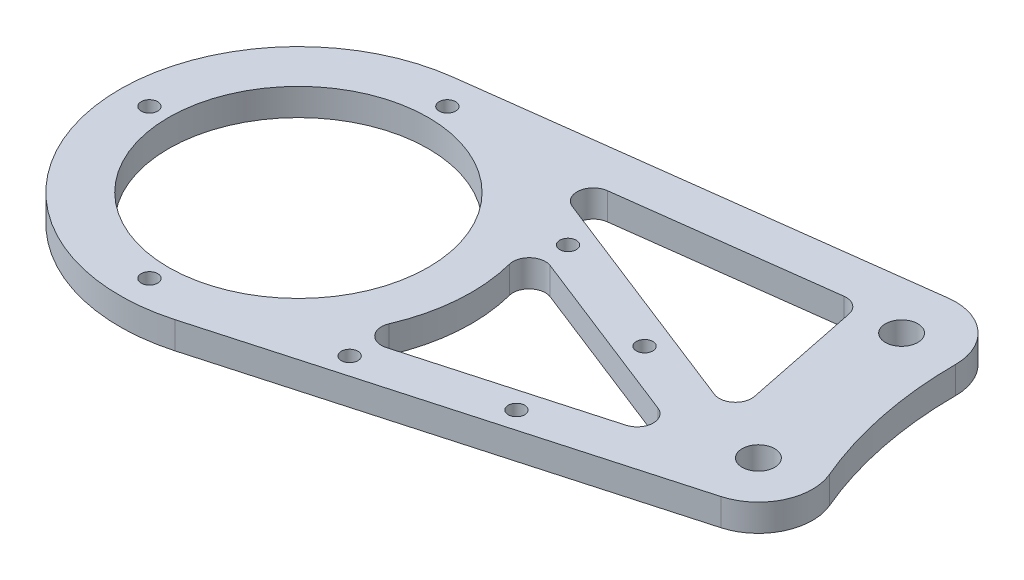
ISO-10303-21;
HEADER;
FILE_DESCRIPTION(('STEP AP214'),'2;1');
FILE_NAME('part.step','',(''),(''),'','','');
FILE_SCHEMA(('AUTOMOTIVE_DESIGN { 1 0 10303 214 1 1 1 1 }'));
ENDSEC;
DATA;
#1=APPLICATION_CONTEXT('core data for automotive mechanical design processes');
#2=APPLICATION_PROTOCOL_DEFINITION('international standard','automotive_design',2000,#1);
#3=PRODUCT_CONTEXT('',#1,'mechanical');
#4=PRODUCT('Part','Part','',(#3));
#5=PRODUCT_RELATED_PRODUCT_CATEGORY('part','',(#4));
#6=PRODUCT_DEFINITION_FORMATION('','',#4);
#7=PRODUCT_DEFINITION_CONTEXT('part definition',#1,'design');
#8=PRODUCT_DEFINITION('design','',#6,#7);
#9=PRODUCT_DEFINITION_SHAPE('','',#8);
#10=(LENGTH_UNIT() NAMED_UNIT(*) SI_UNIT(.MILLI.,.METRE.));
#11=(NAMED_UNIT(*) PLANE_ANGLE_UNIT() SI_UNIT($,.RADIAN.));
#12=(NAMED_UNIT(*) SI_UNIT($,.STERADIAN.) SOLID_ANGLE_UNIT());
#13=UNCERTAINTY_MEASURE_WITH_UNIT(LENGTH_MEASURE(1.E-05),#10,'distance_accuracy_value','');
#14=(GEOMETRIC_REPRESENTATION_CONTEXT(3) GLOBAL_UNCERTAINTY_ASSIGNED_CONTEXT((#13)) GLOBAL_UNIT_ASSIGNED_CONTEXT((#10,
#11,#12)) REPRESENTATION_CONTEXT('',''));
#15=CARTESIAN_POINT('',(0.,0.,0.));
#16=DIRECTION('',(0.,0.,1.));
#17=DIRECTION('',(1.,0.,0.));
#18=AXIS2_PLACEMENT_3D('',#15,#16,#17);
#19=CARTESIAN_POINT('',(0.,5.,0.));
#20=DIRECTION('',(0.,1.,0.));
#21=DIRECTION('',(0.,0.,1.));
#22=AXIS2_PLACEMENT_3D('',#19,#20,#21);
#23=PLANE('',#22);
#24=CARTESIAN_POINT('',(0.,5.,-27.5221634078138));
#25=DIRECTION('',(0.,1.,0.));
#26=DIRECTION('',(0.,0.,1.));
#27=AXIS2_PLACEMENT_3D('',#24,#25,#26);
#28=CIRCLE('',#27,1.525);
#29=CARTESIAN_POINT('',(0.,5.,-25.9971634078138));
#30=VERTEX_POINT('',#29);
#31=EDGE_CURVE('E362',#30,#30,#28,.T.);
#32=ORIENTED_EDGE('',*,*,#31,.F.);
#33=EDGE_LOOP('',(#32));
#34=FACE_BOUND('',#33,.T.);
#35=CARTESIAN_POINT('',(33.3215348622938,5.,-16.496811603075));
#36=DIRECTION('',(0.,1.,0.));
#37=DIRECTION('',(0.,0.,1.));
#38=AXIS2_PLACEMENT_3D('',#35,#36,#37);
#39=CIRCLE('',#38,1.525);
#40=CARTESIAN_POINT('',(33.3215348622938,5.,-14.971811603075));
#41=VERTEX_POINT('',#40);
#42=EDGE_CURVE('E365',#41,#41,#39,.T.);
#43=ORIENTED_EDGE('',*,*,#42,.F.);
#44=EDGE_LOOP('',(#43));
#45=FACE_BOUND('',#44,.T.);
#46=CARTESIAN_POINT('',(-27.5221634078138,5.,0.));
#47=DIRECTION('',(0.,1.,0.));
#48=DIRECTION('',(0.,0.,1.));
#49=AXIS2_PLACEMENT_3D('',#46,#47,#48);
#50=CIRCLE('',#49,1.525);
#51=CARTESIAN_POINT('',(-27.5221634078138,5.,1.525));
#52=VERTEX_POINT('',#51);
#53=EDGE_CURVE('E368',#52,#52,#50,.T.);
#54=ORIENTED_EDGE('',*,*,#53,.F.);
#55=EDGE_LOOP('',(#54));
#56=FACE_BOUND('',#55,.T.);
#57=CARTESIAN_POINT('',(0.,5.,27.5221634078138));
#58=DIRECTION('',(0.,1.,0.));
#59=DIRECTION('',(0.,0.,1.));
#60=AXIS2_PLACEMENT_3D('',#57,#58,#59);
#61=CIRCLE('',#60,1.525);
#62=CARTESIAN_POINT('',(0.,5.,29.0471634078138));
#63=VERTEX_POINT('',#62);
#64=EDGE_CURVE('E371',#63,#63,#61,.T.);
#65=ORIENTED_EDGE('',*,*,#64,.F.);
#66=EDGE_LOOP('',(#65));
#67=FACE_BOUND('',#66,.T.);
#68=CARTESIAN_POINT('',(30.9017025254333,5.,21.4381076218142));
#69=DIRECTION('',(0.,1.,0.));
#70=DIRECTION('',(0.,0.,1.));
#71=AXIS2_PLACEMENT_3D('',#68,#69,#70);
#72=CIRCLE('',#71,1.52499999999999);
#73=CARTESIAN_POINT('',(30.9017025254333,5.,22.9631076218142));
#74=VERTEX_POINT('',#73);
#75=EDGE_CURVE('E374',#74,#74,#72,.T.);
#76=ORIENTED_EDGE('',*,*,#75,.F.);
#77=EDGE_LOOP('',(#76));
#78=FACE_BOUND('',#77,.T.);
#79=CARTESIAN_POINT('',(56.596303963621,5.,-7.3707432667154));
#80=DIRECTION('',(0.,1.,0.));
#81=DIRECTION('',(0.,0.,1.));
#82=AXIS2_PLACEMENT_3D('',#79,#80,#81);
#83=CIRCLE('',#82,1.525);
#84=CARTESIAN_POINT('',(56.596303963621,5.,-5.84574326671541));
#85=VERTEX_POINT('',#84);
#86=EDGE_CURVE('E377',#85,#85,#83,.T.);
#87=ORIENTED_EDGE('',*,*,#86,.F.);
#88=EDGE_LOOP('',(#87));
#89=FACE_BOUND('',#88,.T.);
#90=CARTESIAN_POINT('',(54.9690819907024,5.,14.6734017394612));
#91=DIRECTION('',(0.,1.,0.));
#92=DIRECTION('',(0.,0.,1.));
#93=AXIS2_PLACEMENT_3D('',#90,#91,#92);
#94=CIRCLE('',#93,1.525);
#95=CARTESIAN_POINT('',(54.9690819907024,5.,16.1984017394612));
#96=VERTEX_POINT('',#95);
#97=EDGE_CURVE('E380',#96,#96,#94,.T.);
#98=ORIENTED_EDGE('',*,*,#97,.F.);
#99=EDGE_LOOP('',(#98));
#100=FACE_BOUND('',#99,.T.);
#101=CARTESIAN_POINT('',(0.,5.,0.));
#102=DIRECTION('',(0.,1.,0.));
#103=DIRECTION('',(0.,0.,1.));
#104=AXIS2_PLACEMENT_3D('',#101,#102,#103);
#105=CIRCLE('',#104,24.);
#106=CARTESIAN_POINT('',(0.,5.,24.));
#107=VERTEX_POINT('',#106);
#108=EDGE_CURVE('E212',#107,#107,#105,.T.);
#109=ORIENTED_EDGE('',*,*,#108,.F.);
#110=EDGE_LOOP('',(#109));
#111=FACE_BOUND('',#110,.T.);
#112=CARTESIAN_POINT('',(163.242912543457,5.,-33.2121459215883));
#113=DIRECTION('',(0.,1.,0.));
#114=DIRECTION('',(0.,0.,1.));
#115=AXIS2_PLACEMENT_3D('',#112,#113,#114);
#116=CIRCLE('',#115,75.);
#117=CARTESIAN_POINT('',(88.2429125434574,5.,-33.2121459215884));
#118=VERTEX_POINT('',#117);
#119=CARTESIAN_POINT('',(94.2050485345244,5.,-3.90731128489274));
#120=VERTEX_POINT('',#119);
#121=EDGE_CURVE('E185',#118,#120,#116,.T.);
#122=ORIENTED_EDGE('',*,*,#121,.F.);
#123=CARTESIAN_POINT('',(78.2429125434574,5.,-33.2121459215884));
#124=DIRECTION('',(0.,1.,0.));
#125=DIRECTION('',(0.,0.,1.));
#126=AXIS2_PLACEMENT_3D('',#123,#124,#125);
#127=CIRCLE('',#126,9.99999999999999);
#128=CARTESIAN_POINT('',(76.9721406469134,5.,-43.131074229977));
#129=VERTEX_POINT('',#128);
#130=EDGE_CURVE('E195',#118,#129,#127,.T.);
#131=ORIENTED_EDGE('',*,*,#130,.T.);
#132=DIRECTION('',(0.991892830838866,0.,-0.127077189654403));
#133=VECTOR('',#132,1.);
#134=CARTESIAN_POINT('',(-4.19354725859528,5.,-32.7324634176826));
#135=LINE('',#134,#133);
#136=CARTESIAN_POINT('',(-4.19354725859528,5.,-32.7324634176826));
#137=VERTEX_POINT('',#136);
#138=EDGE_CURVE('E200',#137,#129,#135,.T.);
#139=ORIENTED_EDGE('',*,*,#138,.F.);
#140=CARTESIAN_POINT('',(0.,5.,0.));
#141=DIRECTION('',(0.,1.,0.));
#142=DIRECTION('',(0.,0.,1.));
#143=AXIS2_PLACEMENT_3D('',#140,#141,#142);
#144=CIRCLE('',#143,33.);
#145=CARTESIAN_POINT('',(8.92941176470588,5.,31.7689408941553));
#146=VERTEX_POINT('',#145);
#147=EDGE_CURVE('E216',#137,#146,#144,.T.);
#148=ORIENTED_EDGE('',*,*,#147,.T.);
#149=DIRECTION('',(0.962695178610766,0.,-0.270588235294118));
#150=VECTOR('',#149,1.);
#151=CARTESIAN_POINT('',(8.92941176470588,5.,31.7689408941553));
#152=LINE('',#151,#150);
#153=CARTESIAN_POINT('',(87.7058823529412,5.,9.62695178610766));
#154=VERTEX_POINT('',#153);
#155=EDGE_CURVE('E218',#146,#154,#152,.T.);
#156=ORIENTED_EDGE('',*,*,#155,.T.);
#157=CARTESIAN_POINT('',(85.,5.,0.));
#158=DIRECTION('',(0.,1.,0.));
#159=DIRECTION('',(0.,0.,1.));
#160=AXIS2_PLACEMENT_3D('',#157,#158,#159);
#161=CIRCLE('',#160,9.99999999999999);
#162=EDGE_CURVE('E204',#154,#120,#161,.T.);
#163=ORIENTED_EDGE('',*,*,#162,.T.);
#164=EDGE_LOOP('',(#122,#131,#139,#148,#156,#163));
#165=FACE_BOUND('',#164,.T.);
#166=CARTESIAN_POINT('',(85.,5.,0.));
#167=DIRECTION('',(0.,1.,0.));
#168=DIRECTION('',(0.,0.,1.));
#169=AXIS2_PLACEMENT_3D('',#166,#167,#168);
#170=CIRCLE('',#169,3.00000000000001);
#171=CARTESIAN_POINT('',(85.,5.,3.00000000000001));
#172=VERTEX_POINT('',#171);
#173=EDGE_CURVE('E221',#172,#172,#170,.T.);
#174=ORIENTED_EDGE('',*,*,#173,.F.);
#175=EDGE_LOOP('',(#174));
#176=FACE_BOUND('',#175,.T.);
#177=CARTESIAN_POINT('',(78.2429125434574,5.,-33.2121459215884));
#178=DIRECTION('',(0.,1.,0.));
#179=DIRECTION('',(0.,0.,1.));
#180=AXIS2_PLACEMENT_3D('',#177,#178,#179);
#181=CIRCLE('',#180,3.00000000000002);
#182=CARTESIAN_POINT('',(78.2429125434574,5.,-30.2121459215883));
#183=VERTEX_POINT('',#182);
#184=EDGE_CURVE('E224',#183,#183,#181,.T.);
#185=ORIENTED_EDGE('',*,*,#184,.F.);
#186=EDGE_LOOP('',(#185));
#187=FACE_BOUND('',#186,.T.);
#188=DIRECTION('',(-0.930990764053088,0.,-0.365042733454383));
#189=VECTOR('',#188,1.);
#190=CARTESIAN_POINT('',(11.5069366947841,5.,-29.3468429956469));
#191=LINE('',#190,#189);
#192=CARTESIAN_POINT('',(70.7471802784156,5.,-6.11866363742589));
#193=VERTEX_POINT('',#192);
#194=CARTESIAN_POINT('',(27.5492275878876,5.,-23.056639113286));
#195=VERTEX_POINT('',#194);
#196=EDGE_CURVE('E323',#193,#195,#191,.T.);
#197=ORIENTED_EDGE('',*,*,#196,.T.);
#198=CARTESIAN_POINT('',(28.6443557882508,5.,-25.8496114054452));
#199=DIRECTION('',(0.,1.,0.));
#200=DIRECTION('',(0.,0.,1.));
#201=AXIS2_PLACEMENT_3D('',#198,#199,#200);
#202=CIRCLE('',#201,3.);
#203=CARTESIAN_POINT('',(28.2631242192876,5.,-28.8252898979618));
#204=VERTEX_POINT('',#203);
#205=EDGE_CURVE('E314',#195,#204,#202,.F.);
#206=ORIENTED_EDGE('',*,*,#205,.T.);
#207=DIRECTION('',(0.991892830838866,0.,-0.127077189654402));
#208=VECTOR('',#207,1.);
#209=CARTESIAN_POINT('',(-3.17692974136006,5.,-24.7973207709716));
#210=LINE('',#209,#208);
#211=CARTESIAN_POINT('',(67.0051772793221,5.,-33.7887608206695));
#212=VERTEX_POINT('',#211);
#213=EDGE_CURVE('E329',#204,#212,#210,.T.);
#214=ORIENTED_EDGE('',*,*,#213,.T.);
#215=CARTESIAN_POINT('',(67.3864088482853,5.,-30.8130823281529));
#216=DIRECTION('',(0.,1.,0.));
#217=DIRECTION('',(0.,0.,1.));
#218=AXIS2_PLACEMENT_3D('',#215,#216,#217);
#219=CIRCLE('',#218,3.);
#220=CARTESIAN_POINT('',(70.3261829621477,5.,-31.4111861314045));
#221=VERTEX_POINT('',#220);
#222=EDGE_CURVE('E78',#212,#221,#219,.F.);
#223=ORIENTED_EDGE('',*,*,#222,.T.);
#224=DIRECTION('',(0.199367934417198,0.,0.979924704620829));
#225=VECTOR('',#224,1.);
#226=CARTESIAN_POINT('',(73.6675519539497,5.,-14.9878328379459));
#227=LINE('',#226,#225);
#228=CARTESIAN_POINT('',(74.7820825926413,5.,-9.50973973283677));
#229=VERTEX_POINT('',#228);
#230=EDGE_CURVE('E324',#221,#229,#227,.T.);
#231=ORIENTED_EDGE('',*,*,#230,.T.);
#232=CARTESIAN_POINT('',(71.8423084787788,5.,-8.91163592958517));
#233=DIRECTION('',(0.,1.,0.));
#234=DIRECTION('',(0.,0.,1.));
#235=AXIS2_PLACEMENT_3D('',#232,#233,#234);
#236=CIRCLE('',#235,3.);
#237=EDGE_CURVE('E64',#229,#193,#236,.F.);
#238=ORIENTED_EDGE('',*,*,#237,.T.);
#239=EDGE_LOOP('',(#197,#206,#214,#223,#231,#238));
#240=FACE_BOUND('',#239,.T.);
#241=DIRECTION('',(0.962695178610766,0.,-0.270588235294118));
#242=VECTOR('',#241,1.);
#243=CARTESIAN_POINT('',(6.76470588235294,5.,24.0673794652692));
#244=LINE('',#243,#242);
#245=CARTESIAN_POINT('',(32.9705347593037,5.,16.7016118289686));
#246=VERTEX_POINT('',#245);
#247=CARTESIAN_POINT('',(67.5044798398151,5.,6.99503028093982));
#248=VERTEX_POINT('',#247);
#249=EDGE_CURVE('E356',#246,#248,#244,.T.);
#250=ORIENTED_EDGE('',*,*,#249,.F.);
#251=CARTESIAN_POINT('',(32.1587700534214,5.,13.8135262931363));
#252=DIRECTION('',(0.,1.,0.));
#253=DIRECTION('',(0.,0.,1.));
#254=AXIS2_PLACEMENT_3D('',#251,#252,#253);
#255=CIRCLE('',#254,3.);
#256=CARTESIAN_POINT('',(29.4023040488424,5.,12.6295097537246));
#257=VERTEX_POINT('',#256);
#258=EDGE_CURVE('E310',#246,#257,#255,.F.);
#259=ORIENTED_EDGE('',*,*,#258,.T.);
#260=CARTESIAN_POINT('',(0.,5.,0.));
#261=DIRECTION('',(0.,1.,0.));
#262=DIRECTION('',(0.,0.,1.));
#263=AXIS2_PLACEMENT_3D('',#260,#261,#262);
#264=CIRCLE('',#263,32.);
#265=CARTESIAN_POINT('',(30.9823975337499,5.,-8.0056881690889));
#266=VERTEX_POINT('',#265);
#267=EDGE_CURVE('E359',#257,#266,#264,.T.);
#268=ORIENTED_EDGE('',*,*,#267,.T.);
#269=CARTESIAN_POINT('',(33.8869973025389,5.,-8.75622143494099));
#270=DIRECTION('',(0.,1.,0.));
#271=DIRECTION('',(0.,0.,1.));
#272=AXIS2_PLACEMENT_3D('',#269,#270,#271);
#273=CIRCLE('',#272,3.);
#274=CARTESIAN_POINT('',(34.9821255029021,5.,-11.5491937271002));
#275=VERTEX_POINT('',#274);
#276=EDGE_CURVE('E302',#266,#275,#273,.F.);
#277=ORIENTED_EDGE('',*,*,#276,.T.);
#278=DIRECTION('',(0.930990764053088,0.,0.365042733454383));
#279=VECTOR('',#278,1.);
#280=CARTESIAN_POINT('',(8.58659482714902,5.,-21.8989168832222));
#281=LINE('',#280,#279);
#282=CARTESIAN_POINT('',(67.7878433342959,5.,1.31397245294826));
#283=VERTEX_POINT('',#282);
#284=EDGE_CURVE('E351',#275,#283,#281,.T.);
#285=ORIENTED_EDGE('',*,*,#284,.T.);
#286=CARTESIAN_POINT('',(66.6927151339328,5.,4.10694474510753));
#287=DIRECTION('',(0.,1.,0.));
#288=DIRECTION('',(0.,0.,1.));
#289=AXIS2_PLACEMENT_3D('',#286,#287,#288);
#290=CIRCLE('',#289,3.);
#291=EDGE_CURVE('E306',#283,#248,#290,.F.);
#292=ORIENTED_EDGE('',*,*,#291,.T.);
#293=EDGE_LOOP('',(#250,#259,#268,#277,#285,#292));
#294=FACE_BOUND('',#293,.T.);
#295=ADVANCED_FACE('F56',(#34,#45,#56,#67,#78,#89,#100,#111,#165,#176,#187,#240,#294),#23,.T.);
#296=CARTESIAN_POINT('',(0.,0.,0.));
#297=DIRECTION('',(0.,1.,0.));
#298=DIRECTION('',(0.,0.,1.));
#299=AXIS2_PLACEMENT_3D('',#296,#297,#298);
#300=PLANE('',#299);
#301=CARTESIAN_POINT('',(0.,0.,-27.5221634078138));
#302=DIRECTION('',(0.,-1.,0.));
#303=DIRECTION('',(0.,0.,-1.));
#304=AXIS2_PLACEMENT_3D('',#301,#302,#303);
#305=CIRCLE('',#304,1.525);
#306=CARTESIAN_POINT('',(0.,0.,-29.0471634078138));
#307=VERTEX_POINT('',#306);
#308=EDGE_CURVE('E383',#307,#307,#305,.T.);
#309=ORIENTED_EDGE('',*,*,#308,.F.);
#310=EDGE_LOOP('',(#309));
#311=FACE_BOUND('',#310,.T.);
#312=CARTESIAN_POINT('',(33.3215348622938,0.,-16.496811603075));
#313=DIRECTION('',(0.,-1.,0.));
#314=DIRECTION('',(0.,0.,-1.));
#315=AXIS2_PLACEMENT_3D('',#312,#313,#314);
#316=CIRCLE('',#315,1.525);
#317=CARTESIAN_POINT('',(33.3215348622938,0.,-18.021811603075));
#318=VERTEX_POINT('',#317);
#319=EDGE_CURVE('E399',#318,#318,#316,.T.);
#320=ORIENTED_EDGE('',*,*,#319,.F.);
#321=EDGE_LOOP('',(#320));
#322=FACE_BOUND('',#321,.T.);
#323=CARTESIAN_POINT('',(-27.5221634078138,0.,0.));
#324=DIRECTION('',(0.,-1.,0.));
#325=DIRECTION('',(0.,0.,-1.));
#326=AXIS2_PLACEMENT_3D('',#323,#324,#325);
#327=CIRCLE('',#326,1.525);
#328=CARTESIAN_POINT('',(-27.5221634078138,0.,-1.525));
#329=VERTEX_POINT('',#328);
#330=EDGE_CURVE('E396',#329,#329,#327,.T.);
#331=ORIENTED_EDGE('',*,*,#330,.F.);
#332=EDGE_LOOP('',(#331));
#333=FACE_BOUND('',#332,.T.);
#334=CARTESIAN_POINT('',(0.,0.,27.5221634078138));
#335=DIRECTION('',(0.,-1.,0.));
#336=DIRECTION('',(0.,0.,-1.));
#337=AXIS2_PLACEMENT_3D('',#334,#335,#336);
#338=CIRCLE('',#337,1.525);
#339=CARTESIAN_POINT('',(0.,0.,25.9971634078138));
#340=VERTEX_POINT('',#339);
#341=EDGE_CURVE('E393',#340,#340,#338,.T.);
#342=ORIENTED_EDGE('',*,*,#341,.F.);
#343=EDGE_LOOP('',(#342));
#344=FACE_BOUND('',#343,.T.);
#345=CARTESIAN_POINT('',(30.9017025254333,0.,21.4381076218142));
#346=DIRECTION('',(0.,-1.,0.));
#347=DIRECTION('',(0.,0.,-1.));
#348=AXIS2_PLACEMENT_3D('',#345,#346,#347);
#349=CIRCLE('',#348,1.52499999999999);
#350=CARTESIAN_POINT('',(30.9017025254333,0.,19.9131076218142));
#351=VERTEX_POINT('',#350);
#352=EDGE_CURVE('E390',#351,#351,#349,.T.);
#353=ORIENTED_EDGE('',*,*,#352,.F.);
#354=EDGE_LOOP('',(#353));
#355=FACE_BOUND('',#354,.T.);
#356=CARTESIAN_POINT('',(56.596303963621,0.,-7.3707432667154));
#357=DIRECTION('',(0.,-1.,0.));
#358=DIRECTION('',(0.,0.,-1.));
#359=AXIS2_PLACEMENT_3D('',#356,#357,#358);
#360=CIRCLE('',#359,1.525);
#361=CARTESIAN_POINT('',(56.596303963621,0.,-8.8957432667154));
#362=VERTEX_POINT('',#361);
#363=EDGE_CURVE('E387',#362,#362,#360,.T.);
#364=ORIENTED_EDGE('',*,*,#363,.F.);
#365=EDGE_LOOP('',(#364));
#366=FACE_BOUND('',#365,.T.);
#367=CARTESIAN_POINT('',(54.9690819907024,0.,14.6734017394612));
#368=DIRECTION('',(0.,-1.,0.));
#369=DIRECTION('',(0.,0.,-1.));
#370=AXIS2_PLACEMENT_3D('',#367,#368,#369);
#371=CIRCLE('',#370,1.525);
#372=CARTESIAN_POINT('',(54.9690819907024,0.,13.1484017394612));
#373=VERTEX_POINT('',#372);
#374=EDGE_CURVE('E384',#373,#373,#371,.T.);
#375=ORIENTED_EDGE('',*,*,#374,.F.);
#376=EDGE_LOOP('',(#375));
#377=FACE_BOUND('',#376,.T.);
#378=DIRECTION('',(0.199367934417198,0.,0.979924704620829));
#379=VECTOR('',#378,1.);
#380=CARTESIAN_POINT('',(73.6675519539497,0.,-14.9878328379459));
#381=LINE('',#380,#379);
#382=CARTESIAN_POINT('',(70.3261829621477,0.,-31.4111861314045));
#383=VERTEX_POINT('',#382);
#384=CARTESIAN_POINT('',(74.7820825926413,0.,-9.50973973283677));
#385=VERTEX_POINT('',#384);
#386=EDGE_CURVE('E261',#383,#385,#381,.T.);
#387=ORIENTED_EDGE('',*,*,#386,.F.);
#388=CARTESIAN_POINT('',(67.3864088482853,0.,-30.8130823281529));
#389=DIRECTION('',(0.,1.,0.));
#390=DIRECTION('',(0.,0.,1.));
#391=AXIS2_PLACEMENT_3D('',#388,#389,#390);
#392=CIRCLE('',#391,3.);
#393=CARTESIAN_POINT('',(67.0051772793221,0.,-33.7887608206695));
#394=VERTEX_POINT('',#393);
#395=EDGE_CURVE('E319',#383,#394,#392,.T.);
#396=ORIENTED_EDGE('',*,*,#395,.T.);
#397=DIRECTION('',(0.991892830838866,0.,-0.127077189654402));
#398=VECTOR('',#397,1.);
#399=CARTESIAN_POINT('',(-3.17692974136006,0.,-24.7973207709716));
#400=LINE('',#399,#398);
#401=CARTESIAN_POINT('',(28.2631242192876,0.,-28.8252898979618));
#402=VERTEX_POINT('',#401);
#403=EDGE_CURVE('E191',#402,#394,#400,.T.);
#404=ORIENTED_EDGE('',*,*,#403,.F.);
#405=CARTESIAN_POINT('',(28.6443557882508,0.,-25.8496114054452));
#406=DIRECTION('',(0.,1.,0.));
#407=DIRECTION('',(0.,0.,1.));
#408=AXIS2_PLACEMENT_3D('',#405,#406,#407);
#409=CIRCLE('',#408,3.);
#410=CARTESIAN_POINT('',(27.5492275878876,0.,-23.056639113286));
#411=VERTEX_POINT('',#410);
#412=EDGE_CURVE('E316',#402,#411,#409,.T.);
#413=ORIENTED_EDGE('',*,*,#412,.T.);
#414=DIRECTION('',(-0.930990764053088,0.,-0.365042733454383));
#415=VECTOR('',#414,1.);
#416=CARTESIAN_POINT('',(11.5069366947841,0.,-29.3468429956469));
#417=LINE('',#416,#415);
#418=CARTESIAN_POINT('',(70.7471802784156,0.,-6.11866363742589));
#419=VERTEX_POINT('',#418);
#420=EDGE_CURVE('E258',#419,#411,#417,.T.);
#421=ORIENTED_EDGE('',*,*,#420,.F.);
#422=CARTESIAN_POINT('',(71.8423084787788,0.,-8.91163592958517));
#423=DIRECTION('',(0.,1.,0.));
#424=DIRECTION('',(0.,0.,1.));
#425=AXIS2_PLACEMENT_3D('',#422,#423,#424);
#426=CIRCLE('',#425,3.);
#427=EDGE_CURVE('E12',#419,#385,#426,.T.);
#428=ORIENTED_EDGE('',*,*,#427,.T.);
#429=EDGE_LOOP('',(#387,#396,#404,#413,#421,#428));
#430=FACE_BOUND('',#429,.T.);
#431=CARTESIAN_POINT('',(0.,0.,0.));
#432=DIRECTION('',(0.,1.,0.));
#433=DIRECTION('',(0.,0.,1.));
#434=AXIS2_PLACEMENT_3D('',#431,#432,#433);
#435=CIRCLE('',#434,24.);
#436=CARTESIAN_POINT('',(0.,0.,24.));
#437=VERTEX_POINT('',#436);
#438=EDGE_CURVE('E230',#437,#437,#435,.T.);
#439=ORIENTED_EDGE('',*,*,#438,.T.);
#440=EDGE_LOOP('',(#439));
#441=FACE_BOUND('',#440,.T.);
#442=CARTESIAN_POINT('',(163.242912543457,0.,-33.2121459215883));
#443=DIRECTION('',(0.,1.,0.));
#444=DIRECTION('',(0.,0.,1.));
#445=AXIS2_PLACEMENT_3D('',#442,#443,#444);
#446=CIRCLE('',#445,75.);
#447=CARTESIAN_POINT('',(88.2429125434574,0.,-33.2121459215884));
#448=VERTEX_POINT('',#447);
#449=CARTESIAN_POINT('',(94.2050485345244,0.,-3.90731128489274));
#450=VERTEX_POINT('',#449);
#451=EDGE_CURVE('E187',#448,#450,#446,.T.);
#452=ORIENTED_EDGE('',*,*,#451,.T.);
#453=CARTESIAN_POINT('',(85.,0.,0.));
#454=DIRECTION('',(0.,1.,0.));
#455=DIRECTION('',(0.,0.,1.));
#456=AXIS2_PLACEMENT_3D('',#453,#454,#455);
#457=CIRCLE('',#456,9.99999999999999);
#458=CARTESIAN_POINT('',(87.7058823529412,0.,9.62695178610766));
#459=VERTEX_POINT('',#458);
#460=EDGE_CURVE('E239',#459,#450,#457,.T.);
#461=ORIENTED_EDGE('',*,*,#460,.F.);
#462=DIRECTION('',(0.962695178610766,0.,-0.270588235294118));
#463=VECTOR('',#462,1.);
#464=CARTESIAN_POINT('',(8.92941176470588,0.,31.7689408941553));
#465=LINE('',#464,#463);
#466=CARTESIAN_POINT('',(8.92941176470588,0.,31.7689408941553));
#467=VERTEX_POINT('',#466);
#468=EDGE_CURVE('E237',#467,#459,#465,.T.);
#469=ORIENTED_EDGE('',*,*,#468,.F.);
#470=CARTESIAN_POINT('',(0.,0.,0.));
#471=DIRECTION('',(0.,1.,0.));
#472=DIRECTION('',(0.,0.,1.));
#473=AXIS2_PLACEMENT_3D('',#470,#471,#472);
#474=CIRCLE('',#473,33.);
#475=CARTESIAN_POINT('',(-4.19354725859528,0.,-32.7324634176826));
#476=VERTEX_POINT('',#475);
#477=EDGE_CURVE('E235',#476,#467,#474,.T.);
#478=ORIENTED_EDGE('',*,*,#477,.F.);
#479=DIRECTION('',(0.991892830838866,0.,-0.127077189654403));
#480=VECTOR('',#479,1.);
#481=CARTESIAN_POINT('',(-4.19354725859528,0.,-32.7324634176826));
#482=LINE('',#481,#480);
#483=CARTESIAN_POINT('',(76.9721406469134,0.,-43.131074229977));
#484=VERTEX_POINT('',#483);
#485=EDGE_CURVE('E232',#476,#484,#482,.T.);
#486=ORIENTED_EDGE('',*,*,#485,.T.);
#487=CARTESIAN_POINT('',(78.2429125434574,0.,-33.2121459215884));
#488=DIRECTION('',(0.,1.,0.));
#489=DIRECTION('',(0.,0.,1.));
#490=AXIS2_PLACEMENT_3D('',#487,#488,#489);
#491=CIRCLE('',#490,9.99999999999999);
#492=EDGE_CURVE('E229',#448,#484,#491,.T.);
#493=ORIENTED_EDGE('',*,*,#492,.F.);
#494=EDGE_LOOP('',(#452,#461,#469,#478,#486,#493));
#495=FACE_BOUND('',#494,.T.);
#496=CARTESIAN_POINT('',(85.,0.,0.));
#497=DIRECTION('',(0.,1.,0.));
#498=DIRECTION('',(0.,0.,1.));
#499=AXIS2_PLACEMENT_3D('',#496,#497,#498);
#500=CIRCLE('',#499,3.00000000000001);
#501=CARTESIAN_POINT('',(85.,0.,3.00000000000001));
#502=VERTEX_POINT('',#501);
#503=EDGE_CURVE('E209',#502,#502,#500,.T.);
#504=ORIENTED_EDGE('',*,*,#503,.T.);
#505=EDGE_LOOP('',(#504));
#506=FACE_BOUND('',#505,.T.);
#507=CARTESIAN_POINT('',(78.2429125434574,0.,-33.2121459215884));
#508=DIRECTION('',(0.,1.,0.));
#509=DIRECTION('',(0.,0.,1.));
#510=AXIS2_PLACEMENT_3D('',#507,#508,#509);
#511=CIRCLE('',#510,3.00000000000002);
#512=CARTESIAN_POINT('',(78.2429125434574,0.,-30.2121459215883));
#513=VERTEX_POINT('',#512);
#514=EDGE_CURVE('E206',#513,#513,#511,.T.);
#515=ORIENTED_EDGE('',*,*,#514,.T.);
#516=EDGE_LOOP('',(#515));
#517=FACE_BOUND('',#516,.T.);
#518=CARTESIAN_POINT('',(0.,0.,0.));
#519=DIRECTION('',(0.,1.,0.));
#520=DIRECTION('',(0.,0.,1.));
#521=AXIS2_PLACEMENT_3D('',#518,#519,#520);
#522=CIRCLE('',#521,32.);
#523=CARTESIAN_POINT('',(29.4023040488424,0.,12.6295097537246));
#524=VERTEX_POINT('',#523);
#525=CARTESIAN_POINT('',(30.9823975337499,0.,-8.0056881690889));
#526=VERTEX_POINT('',#525);
#527=EDGE_CURVE('E270',#524,#526,#522,.T.);
#528=ORIENTED_EDGE('',*,*,#527,.F.);
#529=CARTESIAN_POINT('',(32.1587700534214,0.,13.8135262931363));
#530=DIRECTION('',(0.,1.,0.));
#531=DIRECTION('',(0.,0.,1.));
#532=AXIS2_PLACEMENT_3D('',#529,#530,#531);
#533=CIRCLE('',#532,3.);
#534=CARTESIAN_POINT('',(32.9705347593037,0.,16.7016118289686));
#535=VERTEX_POINT('',#534);
#536=EDGE_CURVE('E312',#524,#535,#533,.T.);
#537=ORIENTED_EDGE('',*,*,#536,.T.);
#538=DIRECTION('',(0.962695178610766,0.,-0.270588235294118));
#539=VECTOR('',#538,1.);
#540=CARTESIAN_POINT('',(6.76470588235294,0.,24.0673794652692));
#541=LINE('',#540,#539);
#542=CARTESIAN_POINT('',(67.5044798398151,0.,6.99503028093982));
#543=VERTEX_POINT('',#542);
#544=EDGE_CURVE('E264',#535,#543,#541,.T.);
#545=ORIENTED_EDGE('',*,*,#544,.T.);
#546=CARTESIAN_POINT('',(66.6927151339328,0.,4.10694474510753));
#547=DIRECTION('',(0.,1.,0.));
#548=DIRECTION('',(0.,0.,1.));
#549=AXIS2_PLACEMENT_3D('',#546,#547,#548);
#550=CIRCLE('',#549,3.);
#551=CARTESIAN_POINT('',(67.7878433342959,0.,1.31397245294826));
#552=VERTEX_POINT('',#551);
#553=EDGE_CURVE('E308',#543,#552,#550,.T.);
#554=ORIENTED_EDGE('',*,*,#553,.T.);
#555=DIRECTION('',(0.930990764053088,0.,0.365042733454383));
#556=VECTOR('',#555,1.);
#557=CARTESIAN_POINT('',(8.58659482714902,0.,-21.8989168832222));
#558=LINE('',#557,#556);
#559=CARTESIAN_POINT('',(34.9821255029021,0.,-11.5491937271002));
#560=VERTEX_POINT('',#559);
#561=EDGE_CURVE('E267',#560,#552,#558,.T.);
#562=ORIENTED_EDGE('',*,*,#561,.F.);
#563=CARTESIAN_POINT('',(33.8869973025389,0.,-8.75622143494099));
#564=DIRECTION('',(0.,1.,0.));
#565=DIRECTION('',(0.,0.,1.));
#566=AXIS2_PLACEMENT_3D('',#563,#564,#565);
#567=CIRCLE('',#566,3.);
#568=EDGE_CURVE('E304',#560,#526,#567,.T.);
#569=ORIENTED_EDGE('',*,*,#568,.T.);
#570=EDGE_LOOP('',(#528,#537,#545,#554,#562,#569));
#571=FACE_BOUND('',#570,.T.);
#572=ADVANCED_FACE('F333',(#311,#322,#333,#344,#355,#366,#377,#430,#441,#495,#506,#517,#571),
#300,.F.);
#573=CARTESIAN_POINT('',(163.242912543457,5.,-33.2121459215883));
#574=DIRECTION('',(0.,-1.,0.));
#575=DIRECTION('',(0.,0.,-1.));
#576=AXIS2_PLACEMENT_3D('',#573,#574,#575);
#577=CYLINDRICAL_SURFACE('',#576,75.);
#578=ORIENTED_EDGE('',*,*,#451,.F.);
#579=DIRECTION('',(0.,-1.,0.));
#580=VECTOR('',#579,1.);
#581=CARTESIAN_POINT('',(88.2429125434574,5.,-33.2121459215884));
#582=LINE('',#581,#580);
#583=EDGE_CURVE('E181',#118,#448,#582,.T.);
#584=ORIENTED_EDGE('',*,*,#583,.F.);
#585=ORIENTED_EDGE('',*,*,#121,.T.);
#586=DIRECTION('',(0.,-1.,0.));
#587=VECTOR('',#586,1.);
#588=CARTESIAN_POINT('',(94.2050485345244,5.,-3.90731128489274));
#589=LINE('',#588,#587);
#590=EDGE_CURVE('E227',#120,#450,#589,.T.);
#591=ORIENTED_EDGE('',*,*,#590,.T.);
#592=EDGE_LOOP('',(#578,#584,#585,#591));
#593=FACE_BOUND('',#592,.T.);
#594=ADVANCED_FACE('F183',(#593),#577,.F.);
#595=CARTESIAN_POINT('',(78.2429125434574,5.,-33.2121459215884));
#596=DIRECTION('',(0.,-1.,0.));
#597=DIRECTION('',(0.,0.,-1.));
#598=AXIS2_PLACEMENT_3D('',#595,#596,#597);
#599=CYLINDRICAL_SURFACE('',#598,9.99999999999999);
#600=ORIENTED_EDGE('',*,*,#492,.T.);
#601=DIRECTION('',(0.,-1.,0.));
#602=VECTOR('',#601,1.);
#603=CARTESIAN_POINT('',(76.9721406469134,5.,-43.131074229977));
#604=LINE('',#603,#602);
#605=EDGE_CURVE('E192',#129,#484,#604,.T.);
#606=ORIENTED_EDGE('',*,*,#605,.F.);
#607=ORIENTED_EDGE('',*,*,#130,.F.);
#608=ORIENTED_EDGE('',*,*,#583,.T.);
#609=EDGE_LOOP('',(#600,#606,#607,#608));
#610=FACE_BOUND('',#609,.T.);
#611=ADVANCED_FACE('F196',(#610),#599,.T.);
#612=CARTESIAN_POINT('',(-4.19354725859528,5.,-32.7324634176826));
#613=DIRECTION('',(-0.127077189654403,0.,-0.991892830838866));
#614=DIRECTION('',(-0.991892830838866,0.,0.127077189654403));
#615=AXIS2_PLACEMENT_3D('',#612,#613,#614);
#616=PLANE('',#615);
#617=ORIENTED_EDGE('',*,*,#485,.F.);
#618=DIRECTION('',(0.,-1.,0.));
#619=VECTOR('',#618,1.);
#620=CARTESIAN_POINT('',(-4.19354725859528,5.,-32.7324634176826));
#621=LINE('',#620,#619);
#622=EDGE_CURVE('E251',#137,#476,#621,.T.);
#623=ORIENTED_EDGE('',*,*,#622,.F.);
#624=ORIENTED_EDGE('',*,*,#138,.T.);
#625=ORIENTED_EDGE('',*,*,#605,.T.);
#626=EDGE_LOOP('',(#617,#623,#624,#625));
#627=FACE_BOUND('',#626,.T.);
#628=ADVANCED_FACE('F465',(#627),#616,.T.);
#629=CARTESIAN_POINT('',(0.,5.,0.));
#630=DIRECTION('',(0.,-1.,0.));
#631=DIRECTION('',(0.,0.,-1.));
#632=AXIS2_PLACEMENT_3D('',#629,#630,#631);
#633=CYLINDRICAL_SURFACE('',#632,33.);
#634=ORIENTED_EDGE('',*,*,#477,.T.);
#635=DIRECTION('',(0.,-1.,0.));
#636=VECTOR('',#635,1.);
#637=CARTESIAN_POINT('',(8.92941176470588,5.,31.7689408941553));
#638=LINE('',#637,#636);
#639=EDGE_CURVE('E248',#146,#467,#638,.T.);
#640=ORIENTED_EDGE('',*,*,#639,.F.);
#641=ORIENTED_EDGE('',*,*,#147,.F.);
#642=ORIENTED_EDGE('',*,*,#622,.T.);
#643=EDGE_LOOP('',(#634,#640,#641,#642));
#644=FACE_BOUND('',#643,.T.);
#645=ADVANCED_FACE('F461',(#644),#633,.T.);
#646=CARTESIAN_POINT('',(8.92941176470588,5.,31.7689408941553));
#647=DIRECTION('',(-0.270588235294118,0.,-0.962695178610766));
#648=DIRECTION('',(-0.962695178610766,0.,0.270588235294118));
#649=AXIS2_PLACEMENT_3D('',#646,#647,#648);
#650=PLANE('',#649);
#651=ORIENTED_EDGE('',*,*,#468,.T.);
#652=DIRECTION('',(0.,-1.,0.));
#653=VECTOR('',#652,1.);
#654=CARTESIAN_POINT('',(87.7058823529412,5.,9.62695178610766));
#655=LINE('',#654,#653);
#656=EDGE_CURVE('E245',#154,#459,#655,.T.);
#657=ORIENTED_EDGE('',*,*,#656,.F.);
#658=ORIENTED_EDGE('',*,*,#155,.F.);
#659=ORIENTED_EDGE('',*,*,#639,.T.);
#660=EDGE_LOOP('',(#651,#657,#658,#659));
#661=FACE_BOUND('',#660,.T.);
#662=ADVANCED_FACE('F454',(#661),#650,.F.);
#663=CARTESIAN_POINT('',(85.,5.,0.));
#664=DIRECTION('',(0.,-1.,0.));
#665=DIRECTION('',(0.,0.,-1.));
#666=AXIS2_PLACEMENT_3D('',#663,#664,#665);
#667=CYLINDRICAL_SURFACE('',#666,3.00000000000001);
#668=ORIENTED_EDGE('',*,*,#173,.T.);
#669=EDGE_LOOP('',(#668));
#670=FACE_BOUND('',#669,.T.);
#671=ORIENTED_EDGE('',*,*,#503,.F.);
#672=EDGE_LOOP('',(#671));
#673=FACE_BOUND('',#672,.T.);
#674=ADVANCED_FACE('F451',(#670,#673),#667,.F.);
#675=CARTESIAN_POINT('',(85.,5.,0.));
#676=DIRECTION('',(0.,-1.,0.));
#677=DIRECTION('',(0.,0.,-1.));
#678=AXIS2_PLACEMENT_3D('',#675,#676,#677);
#679=CYLINDRICAL_SURFACE('',#678,9.99999999999999);
#680=ORIENTED_EDGE('',*,*,#460,.T.);
#681=ORIENTED_EDGE('',*,*,#590,.F.);
#682=ORIENTED_EDGE('',*,*,#162,.F.);
#683=ORIENTED_EDGE('',*,*,#656,.T.);
#684=EDGE_LOOP('',(#680,#681,#682,#683));
#685=FACE_BOUND('',#684,.T.);
#686=ADVANCED_FACE('F449',(#685),#679,.T.);
#687=CARTESIAN_POINT('',(78.2429125434574,5.,-33.2121459215884));
#688=DIRECTION('',(0.,-1.,0.));
#689=DIRECTION('',(0.,0.,-1.));
#690=AXIS2_PLACEMENT_3D('',#687,#688,#689);
#691=CYLINDRICAL_SURFACE('',#690,3.00000000000002);
#692=ORIENTED_EDGE('',*,*,#184,.T.);
#693=EDGE_LOOP('',(#692));
#694=FACE_BOUND('',#693,.T.);
#695=ORIENTED_EDGE('',*,*,#514,.F.);
#696=EDGE_LOOP('',(#695));
#697=FACE_BOUND('',#696,.T.);
#698=ADVANCED_FACE('F446',(#694,#697),#691,.F.);
#699=CARTESIAN_POINT('',(0.,-5.,0.));
#700=DIRECTION('',(0.,1.,0.));
#701=DIRECTION('',(0.,0.,1.));
#702=AXIS2_PLACEMENT_3D('',#699,#700,#701);
#703=CYLINDRICAL_SURFACE('',#702,24.);
#704=ORIENTED_EDGE('',*,*,#108,.T.);
#705=EDGE_LOOP('',(#704));
#706=FACE_BOUND('',#705,.T.);
#707=ORIENTED_EDGE('',*,*,#438,.F.);
#708=EDGE_LOOP('',(#707));
#709=FACE_BOUND('',#708,.T.);
#710=ADVANCED_FACE('F443',(#706,#709),#703,.F.);
#711=CARTESIAN_POINT('',(73.6675519539497,-5.,-14.9878328379459));
#712=DIRECTION('',(-0.979924704620829,0.,0.199367934417198));
#713=DIRECTION('',(0.199367934417198,0.,0.979924704620829));
#714=AXIS2_PLACEMENT_3D('',#711,#712,#713);
#715=PLANE('',#714);
#716=ORIENTED_EDGE('',*,*,#230,.F.);
#717=DIRECTION('',(0.,1.,0.));
#718=VECTOR('',#717,1.);
#719=CARTESIAN_POINT('',(70.3261829621477,0.,-31.4111861314045));
#720=LINE('',#719,#718);
#721=EDGE_CURVE('E300',#221,#383,#720,.F.);
#722=ORIENTED_EDGE('',*,*,#721,.T.);
#723=ORIENTED_EDGE('',*,*,#386,.T.);
#724=DIRECTION('',(0.,1.,0.));
#725=VECTOR('',#724,1.);
#726=CARTESIAN_POINT('',(74.7820825926413,5.,-9.50973973283677));
#727=LINE('',#726,#725);
#728=EDGE_CURVE('E298',#385,#229,#727,.T.);
#729=ORIENTED_EDGE('',*,*,#728,.T.);
#730=EDGE_LOOP('',(#716,#722,#723,#729));
#731=FACE_BOUND('',#730,.T.);
#732=ADVANCED_FACE('F337',(#731),#715,.T.);
#733=CARTESIAN_POINT('',(11.5069366947841,-5.,-29.3468429956469));
#734=DIRECTION('',(0.365042733454383,0.,-0.930990764053088));
#735=DIRECTION('',(-0.930990764053088,0.,-0.365042733454383));
#736=AXIS2_PLACEMENT_3D('',#733,#734,#735);
#737=PLANE('',#736);
#738=ORIENTED_EDGE('',*,*,#420,.T.);
#739=DIRECTION('',(0.,1.,0.));
#740=VECTOR('',#739,1.);
#741=CARTESIAN_POINT('',(27.5492275878876,5.,-23.056639113286));
#742=LINE('',#741,#740);
#743=EDGE_CURVE('E290',#411,#195,#742,.T.);
#744=ORIENTED_EDGE('',*,*,#743,.T.);
#745=ORIENTED_EDGE('',*,*,#196,.F.);
#746=DIRECTION('',(0.,1.,0.));
#747=VECTOR('',#746,1.);
#748=CARTESIAN_POINT('',(70.7471802784156,0.,-6.1186636374259));
#749=LINE('',#748,#747);
#750=EDGE_CURVE('E288',#193,#419,#749,.F.);
#751=ORIENTED_EDGE('',*,*,#750,.T.);
#752=EDGE_LOOP('',(#738,#744,#745,#751));
#753=FACE_BOUND('',#752,.T.);
#754=ADVANCED_FACE('F326',(#753),#737,.T.);
#755=CARTESIAN_POINT('',(-3.17692974136006,-5.,-24.7973207709716));
#756=DIRECTION('',(0.127077189654402,0.,0.991892830838866));
#757=DIRECTION('',(0.991892830838866,0.,-0.127077189654402));
#758=AXIS2_PLACEMENT_3D('',#755,#756,#757);
#759=PLANE('',#758);
#760=ORIENTED_EDGE('',*,*,#213,.F.);
#761=DIRECTION('',(0.,1.,0.));
#762=VECTOR('',#761,1.);
#763=CARTESIAN_POINT('',(28.2631242192876,0.,-28.8252898979618));
#764=LINE('',#763,#762);
#765=EDGE_CURVE('E296',#204,#402,#764,.F.);
#766=ORIENTED_EDGE('',*,*,#765,.T.);
#767=ORIENTED_EDGE('',*,*,#403,.T.);
#768=DIRECTION('',(0.,1.,0.));
#769=VECTOR('',#768,1.);
#770=CARTESIAN_POINT('',(67.0051772793221,5.,-33.7887608206695));
#771=LINE('',#770,#769);
#772=EDGE_CURVE('E293',#394,#212,#771,.T.);
#773=ORIENTED_EDGE('',*,*,#772,.T.);
#774=EDGE_LOOP('',(#760,#766,#767,#773));
#775=FACE_BOUND('',#774,.T.);
#776=ADVANCED_FACE('F346',(#775),#759,.T.);
#777=CARTESIAN_POINT('',(0.,-5.,0.));
#778=DIRECTION('',(0.,1.,0.));
#779=DIRECTION('',(0.,0.,1.));
#780=AXIS2_PLACEMENT_3D('',#777,#778,#779);
#781=CYLINDRICAL_SURFACE('',#780,32.);
#782=ORIENTED_EDGE('',*,*,#527,.T.);
#783=DIRECTION('',(0.,1.,0.));
#784=VECTOR('',#783,1.);
#785=CARTESIAN_POINT('',(30.9823975337499,-5.,-8.0056881690889));
#786=LINE('',#785,#784);
#787=EDGE_CURVE('E275',#526,#266,#786,.T.);
#788=ORIENTED_EDGE('',*,*,#787,.T.);
#789=ORIENTED_EDGE('',*,*,#267,.F.);
#790=DIRECTION('',(0.,1.,0.));
#791=VECTOR('',#790,1.);
#792=CARTESIAN_POINT('',(29.4023040488424,-5.,12.6295097537246));
#793=LINE('',#792,#791);
#794=EDGE_CURVE('E273',#257,#524,#793,.F.);
#795=ORIENTED_EDGE('',*,*,#794,.T.);
#796=EDGE_LOOP('',(#782,#788,#789,#795));
#797=FACE_BOUND('',#796,.T.);
#798=ADVANCED_FACE('F618',(#797),#781,.T.);
#799=CARTESIAN_POINT('',(8.58659482714902,-5.,-21.8989168832222));
#800=DIRECTION('',(-0.365042733454383,0.,0.930990764053088));
#801=DIRECTION('',(0.930990764053088,0.,0.365042733454383));
#802=AXIS2_PLACEMENT_3D('',#799,#800,#801);
#803=PLANE('',#802);
#804=ORIENTED_EDGE('',*,*,#284,.F.);
#805=DIRECTION('',(0.,-1.,0.));
#806=VECTOR('',#805,1.);
#807=CARTESIAN_POINT('',(34.9821255029021,0.,-11.5491937271002));
#808=LINE('',#807,#806);
#809=EDGE_CURVE('E281',#275,#560,#808,.T.);
#810=ORIENTED_EDGE('',*,*,#809,.T.);
#811=ORIENTED_EDGE('',*,*,#561,.T.);
#812=DIRECTION('',(0.,1.,0.));
#813=VECTOR('',#812,1.);
#814=CARTESIAN_POINT('',(67.7878433342959,-5.,1.31397245294826));
#815=LINE('',#814,#813);
#816=EDGE_CURVE('E278',#552,#283,#815,.T.);
#817=ORIENTED_EDGE('',*,*,#816,.T.);
#818=EDGE_LOOP('',(#804,#810,#811,#817));
#819=FACE_BOUND('',#818,.T.);
#820=ADVANCED_FACE('F616',(#819),#803,.T.);
#821=CARTESIAN_POINT('',(6.76470588235294,-5.,24.0673794652692));
#822=DIRECTION('',(0.270588235294118,0.,0.962695178610766));
#823=DIRECTION('',(0.962695178610766,0.,-0.270588235294118));
#824=AXIS2_PLACEMENT_3D('',#821,#822,#823);
#825=PLANE('',#824);
#826=ORIENTED_EDGE('',*,*,#249,.T.);
#827=DIRECTION('',(0.,1.,0.));
#828=VECTOR('',#827,1.);
#829=CARTESIAN_POINT('',(67.5044798398151,-5.,6.99503028093982));
#830=LINE('',#829,#828);
#831=EDGE_CURVE('E286',#248,#543,#830,.F.);
#832=ORIENTED_EDGE('',*,*,#831,.T.);
#833=ORIENTED_EDGE('',*,*,#544,.F.);
#834=DIRECTION('',(0.,1.,0.));
#835=VECTOR('',#834,1.);
#836=CARTESIAN_POINT('',(32.9705347593037,-5.,16.7016118289686));
#837=LINE('',#836,#835);
#838=EDGE_CURVE('E283',#535,#246,#837,.T.);
#839=ORIENTED_EDGE('',*,*,#838,.T.);
#840=EDGE_LOOP('',(#826,#832,#833,#839));
#841=FACE_BOUND('',#840,.T.);
#842=ADVANCED_FACE('F478',(#841),#825,.F.);
#843=CARTESIAN_POINT('',(33.8869973025389,-5.,-8.75622143494099));
#844=DIRECTION('',(0.,1.,0.));
#845=DIRECTION('',(0.,0.,1.));
#846=AXIS2_PLACEMENT_3D('',#843,#844,#845);
#847=CYLINDRICAL_SURFACE('',#846,3.);
#848=ORIENTED_EDGE('',*,*,#568,.F.);
#849=ORIENTED_EDGE('',*,*,#809,.F.);
#850=ORIENTED_EDGE('',*,*,#276,.F.);
#851=ORIENTED_EDGE('',*,*,#787,.F.);
#852=EDGE_LOOP('',(#848,#849,#850,#851));
#853=FACE_BOUND('',#852,.T.);
#854=ADVANCED_FACE('F474',(#853),#847,.F.);
#855=CARTESIAN_POINT('',(66.6927151339328,-5.,4.10694474510753));
#856=DIRECTION('',(0.,1.,0.));
#857=DIRECTION('',(0.,0.,1.));
#858=AXIS2_PLACEMENT_3D('',#855,#856,#857);
#859=CYLINDRICAL_SURFACE('',#858,3.);
#860=ORIENTED_EDGE('',*,*,#553,.F.);
#861=ORIENTED_EDGE('',*,*,#831,.F.);
#862=ORIENTED_EDGE('',*,*,#291,.F.);
#863=ORIENTED_EDGE('',*,*,#816,.F.);
#864=EDGE_LOOP('',(#860,#861,#862,#863));
#865=FACE_BOUND('',#864,.T.);
#866=ADVANCED_FACE('F477',(#865),#859,.F.);
#867=CARTESIAN_POINT('',(32.1587700534214,-5.,13.8135262931363));
#868=DIRECTION('',(0.,1.,0.));
#869=DIRECTION('',(0.,0.,1.));
#870=AXIS2_PLACEMENT_3D('',#867,#868,#869);
#871=CYLINDRICAL_SURFACE('',#870,3.);
#872=ORIENTED_EDGE('',*,*,#536,.F.);
#873=ORIENTED_EDGE('',*,*,#794,.F.);
#874=ORIENTED_EDGE('',*,*,#258,.F.);
#875=ORIENTED_EDGE('',*,*,#838,.F.);
#876=EDGE_LOOP('',(#872,#873,#874,#875));
#877=FACE_BOUND('',#876,.T.);
#878=ADVANCED_FACE('F482',(#877),#871,.F.);
#879=CARTESIAN_POINT('',(28.6443557882508,-5.,-25.8496114054452));
#880=DIRECTION('',(0.,-1.,0.));
#881=DIRECTION('',(0.,0.,-1.));
#882=AXIS2_PLACEMENT_3D('',#879,#880,#881);
#883=CYLINDRICAL_SURFACE('',#882,3.);
#884=ORIENTED_EDGE('',*,*,#412,.F.);
#885=ORIENTED_EDGE('',*,*,#765,.F.);
#886=ORIENTED_EDGE('',*,*,#205,.F.);
#887=ORIENTED_EDGE('',*,*,#743,.F.);
#888=EDGE_LOOP('',(#884,#885,#886,#887));
#889=FACE_BOUND('',#888,.T.);
#890=ADVANCED_FACE('F349',(#889),#883,.F.);
#891=CARTESIAN_POINT('',(67.3864088482853,-5.,-30.8130823281529));
#892=DIRECTION('',(0.,-1.,0.));
#893=DIRECTION('',(0.,0.,-1.));
#894=AXIS2_PLACEMENT_3D('',#891,#892,#893);
#895=CYLINDRICAL_SURFACE('',#894,3.);
#896=ORIENTED_EDGE('',*,*,#395,.F.);
#897=ORIENTED_EDGE('',*,*,#721,.F.);
#898=ORIENTED_EDGE('',*,*,#222,.F.);
#899=ORIENTED_EDGE('',*,*,#772,.F.);
#900=EDGE_LOOP('',(#896,#897,#898,#899));
#901=FACE_BOUND('',#900,.T.);
#902=ADVANCED_FACE('F340',(#901),#895,.F.);
#903=CARTESIAN_POINT('',(71.8423084787788,-5.,-8.91163592958517));
#904=DIRECTION('',(0.,-1.,0.));
#905=DIRECTION('',(0.,0.,-1.));
#906=AXIS2_PLACEMENT_3D('',#903,#904,#905);
#907=CYLINDRICAL_SURFACE('',#906,3.);
#908=ORIENTED_EDGE('',*,*,#427,.F.);
#909=ORIENTED_EDGE('',*,*,#750,.F.);
#910=ORIENTED_EDGE('',*,*,#237,.F.);
#911=ORIENTED_EDGE('',*,*,#728,.F.);
#912=EDGE_LOOP('',(#908,#909,#910,#911));
#913=FACE_BOUND('',#912,.T.);
#914=ADVANCED_FACE('F58',(#913),#907,.F.);
#915=CARTESIAN_POINT('',(54.9690819907024,10.,14.6734017394612));
#916=DIRECTION('',(0.,-1.,0.));
#917=DIRECTION('',(0.,0.,-1.));
#918=AXIS2_PLACEMENT_3D('',#915,#916,#917);
#919=CYLINDRICAL_SURFACE('',#918,1.525);
#920=ORIENTED_EDGE('',*,*,#97,.T.);
#921=EDGE_LOOP('',(#920));
#922=FACE_BOUND('',#921,.T.);
#923=ORIENTED_EDGE('',*,*,#374,.T.);
#924=EDGE_LOOP('',(#923));
#925=FACE_BOUND('',#924,.T.);
#926=ADVANCED_FACE('F422',(#922,#925),#919,.F.);
#927=CARTESIAN_POINT('',(56.596303963621,10.,-7.3707432667154));
#928=DIRECTION('',(0.,-1.,0.));
#929=DIRECTION('',(0.,0.,-1.));
#930=AXIS2_PLACEMENT_3D('',#927,#928,#929);
#931=CYLINDRICAL_SURFACE('',#930,1.525);
#932=ORIENTED_EDGE('',*,*,#86,.T.);
#933=EDGE_LOOP('',(#932));
#934=FACE_BOUND('',#933,.T.);
#935=ORIENTED_EDGE('',*,*,#363,.T.);
#936=EDGE_LOOP('',(#935));
#937=FACE_BOUND('',#936,.T.);
#938=ADVANCED_FACE('F424',(#934,#937),#931,.F.);
#939=CARTESIAN_POINT('',(30.9017025254333,10.,21.4381076218142));
#940=DIRECTION('',(0.,-1.,0.));
#941=DIRECTION('',(0.,0.,-1.));
#942=AXIS2_PLACEMENT_3D('',#939,#940,#941);
#943=CYLINDRICAL_SURFACE('',#942,1.52499999999999);
#944=ORIENTED_EDGE('',*,*,#75,.T.);
#945=EDGE_LOOP('',(#944));
#946=FACE_BOUND('',#945,.T.);
#947=ORIENTED_EDGE('',*,*,#352,.T.);
#948=EDGE_LOOP('',(#947));
#949=FACE_BOUND('',#948,.T.);
#950=ADVANCED_FACE('F431',(#946,#949),#943,.F.);
#951=CARTESIAN_POINT('',(0.,10.,27.5221634078138));
#952=DIRECTION('',(0.,-1.,0.));
#953=DIRECTION('',(0.,0.,-1.));
#954=AXIS2_PLACEMENT_3D('',#951,#952,#953);
#955=CYLINDRICAL_SURFACE('',#954,1.525);
#956=ORIENTED_EDGE('',*,*,#64,.T.);
#957=EDGE_LOOP('',(#956));
#958=FACE_BOUND('',#957,.T.);
#959=ORIENTED_EDGE('',*,*,#341,.T.);
#960=EDGE_LOOP('',(#959));
#961=FACE_BOUND('',#960,.T.);
#962=ADVANCED_FACE('F530',(#958,#961),#955,.F.);
#963=CARTESIAN_POINT('',(-27.5221634078138,10.,0.));
#964=DIRECTION('',(0.,-1.,0.));
#965=DIRECTION('',(0.,0.,-1.));
#966=AXIS2_PLACEMENT_3D('',#963,#964,#965);
#967=CYLINDRICAL_SURFACE('',#966,1.525);
#968=ORIENTED_EDGE('',*,*,#53,.T.);
#969=EDGE_LOOP('',(#968));
#970=FACE_BOUND('',#969,.T.);
#971=ORIENTED_EDGE('',*,*,#330,.T.);
#972=EDGE_LOOP('',(#971));
#973=FACE_BOUND('',#972,.T.);
#974=ADVANCED_FACE('F540',(#970,#973),#967,.F.);
#975=CARTESIAN_POINT('',(33.3215348622938,10.,-16.496811603075));
#976=DIRECTION('',(0.,-1.,0.));
#977=DIRECTION('',(0.,0.,-1.));
#978=AXIS2_PLACEMENT_3D('',#975,#976,#977);
#979=CYLINDRICAL_SURFACE('',#978,1.525);
#980=ORIENTED_EDGE('',*,*,#42,.T.);
#981=EDGE_LOOP('',(#980));
#982=FACE_BOUND('',#981,.T.);
#983=ORIENTED_EDGE('',*,*,#319,.T.);
#984=EDGE_LOOP('',(#983));
#985=FACE_BOUND('',#984,.T.);
#986=ADVANCED_FACE('F550',(#982,#985),#979,.F.);
#987=CARTESIAN_POINT('',(0.,10.,-27.5221634078138));
#988=DIRECTION('',(0.,-1.,0.));
#989=DIRECTION('',(0.,0.,-1.));
#990=AXIS2_PLACEMENT_3D('',#987,#988,#989);
#991=CYLINDRICAL_SURFACE('',#990,1.525);
#992=ORIENTED_EDGE('',*,*,#31,.T.);
#993=EDGE_LOOP('',(#992));
#994=FACE_BOUND('',#993,.T.);
#995=ORIENTED_EDGE('',*,*,#308,.T.);
#996=EDGE_LOOP('',(#995));
#997=FACE_BOUND('',#996,.T.);
#998=ADVANCED_FACE('F405',(#994,#997),#991,.F.);
#999=CLOSED_SHELL('',(#295,#572,#594,#611,#628,#645,#662,#674,#686,#698,#710,#732,#754,#776,
#798,#820,#842,#854,#866,#878,#890,#902,#914,#926,#938,#950,#962,#974,#986,#998));
#1000=MANIFOLD_SOLID_BREP('B2',#999);
#1001=ADVANCED_BREP_SHAPE_REPRESENTATION('',(#18,#1000),#14);
#1002=SHAPE_DEFINITION_REPRESENTATION(#9,#1001);
ENDSEC;
END-ISO-10303-21;
